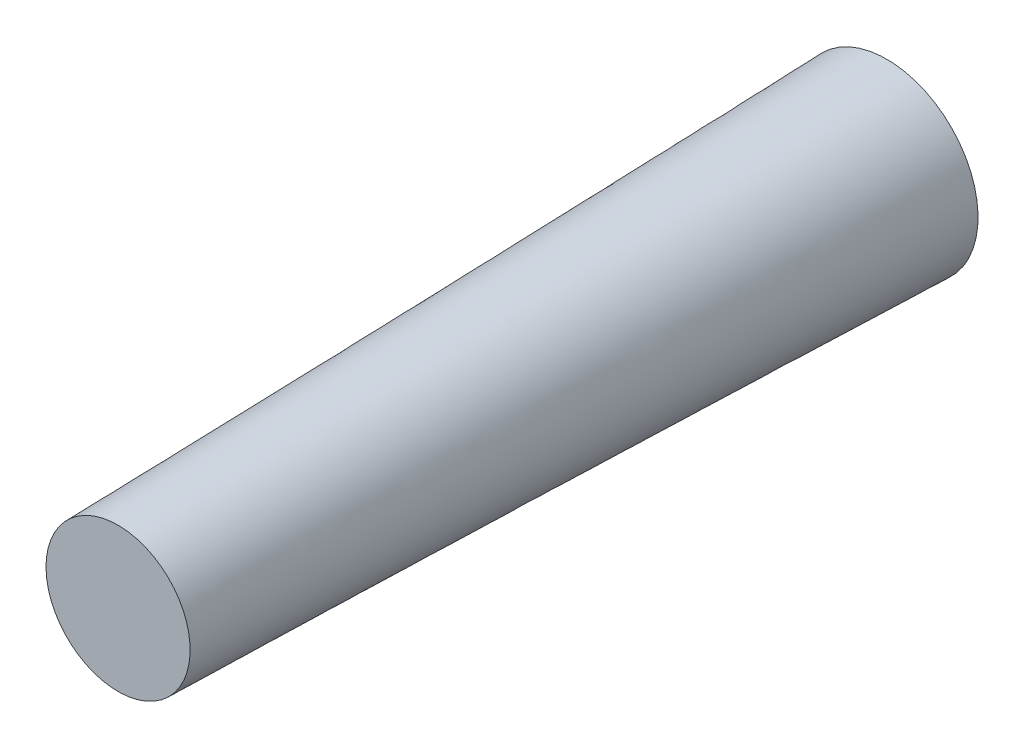
ISO-10303-21;
HEADER;
FILE_DESCRIPTION(('STEP AP214'),'2;1');
FILE_NAME('part.step','',(''),(''),'','','');
FILE_SCHEMA(('AUTOMOTIVE_DESIGN { 1 0 10303 214 1 1 1 1 }'));
ENDSEC;
DATA;
#1=APPLICATION_CONTEXT('core data for automotive mechanical design processes');
#2=APPLICATION_PROTOCOL_DEFINITION('international standard','automotive_design',2000,#1);
#3=PRODUCT_CONTEXT('',#1,'mechanical');
#4=PRODUCT('Part','Part','',(#3));
#5=PRODUCT_RELATED_PRODUCT_CATEGORY('part','',(#4));
#6=PRODUCT_DEFINITION_FORMATION('','',#4);
#7=PRODUCT_DEFINITION_CONTEXT('part definition',#1,'design');
#8=PRODUCT_DEFINITION('design','',#6,#7);
#9=PRODUCT_DEFINITION_SHAPE('','',#8);
#10=(LENGTH_UNIT() NAMED_UNIT(*) SI_UNIT(.MILLI.,.METRE.));
#11=(NAMED_UNIT(*) PLANE_ANGLE_UNIT() SI_UNIT($,.RADIAN.));
#12=(NAMED_UNIT(*) SI_UNIT($,.STERADIAN.) SOLID_ANGLE_UNIT());
#13=UNCERTAINTY_MEASURE_WITH_UNIT(LENGTH_MEASURE(1.E-05),#10,'distance_accuracy_value','');
#14=(GEOMETRIC_REPRESENTATION_CONTEXT(3) GLOBAL_UNCERTAINTY_ASSIGNED_CONTEXT((#13)) GLOBAL_UNIT_ASSIGNED_CONTEXT((#10,
#11,#12)) REPRESENTATION_CONTEXT('',''));
#15=CARTESIAN_POINT('',(0.,0.,0.));
#16=DIRECTION('',(0.,0.,1.));
#17=DIRECTION('',(1.,0.,0.));
#18=AXIS2_PLACEMENT_3D('',#15,#16,#17);
#19=CARTESIAN_POINT('',(0.,0.,0.));
#20=DIRECTION('',(0.,0.,1.));
#21=DIRECTION('',(1.,0.,0.));
#22=AXIS2_PLACEMENT_3D('',#19,#20,#21);
#23=PLANE('',#22);
#24=CARTESIAN_POINT('',(0.,0.,0.));
#25=DIRECTION('',(0.,0.,1.));
#26=DIRECTION('',(1.,0.,0.));
#27=AXIS2_PLACEMENT_3D('',#24,#25,#26);
#28=CIRCLE('',#27,12.065);
#29=CARTESIAN_POINT('',(-11.6089307231053,3.28587164480635,0.));
#30=VERTEX_POINT('',#29);
#31=EDGE_CURVE('E11',#30,#30,#28,.T.);
#32=ORIENTED_EDGE('',*,*,#31,.F.);
#33=EDGE_LOOP('',(#32));
#34=FACE_BOUND('',#33,.T.);
#35=ADVANCED_FACE('F35',(#34),#23,.F.);
#36=CARTESIAN_POINT('',(0.,0.,101.6));
#37=DIRECTION('',(0.,0.,1.));
#38=DIRECTION('',(1.,0.,0.));
#39=AXIS2_PLACEMENT_3D('',#36,#37,#38);
#40=PLANE('',#39);
#41=CARTESIAN_POINT('',(0.,0.,101.6));
#42=DIRECTION('',(0.,0.,1.));
#43=DIRECTION('',(1.,0.,0.));
#44=AXIS2_PLACEMENT_3D('',#41,#42,#43);
#45=CIRCLE('',#44,9.525);
#46=CARTESIAN_POINT('',(-9.5248796700365,-0.0478776704257421,101.6));
#47=VERTEX_POINT('',#46);
#48=EDGE_CURVE('E43',#47,#47,#45,.T.);
#49=ORIENTED_EDGE('',*,*,#48,.T.);
#50=EDGE_LOOP('',(#49));
#51=FACE_BOUND('',#50,.T.);
#52=ADVANCED_FACE('F67',(#51),#40,.T.);
#53=CARTESIAN_POINT('',(-9.5248796700365,-0.0478776704257421,101.6));
#54=CARTESIAN_POINT('',(-11.6089307231053,3.28587164480635,0.));
#55=CARTESIAN_POINT('',(-9.62063501088798,19.0018816696473,101.6));
#56=CARTESIAN_POINT('',(-5.03718743349257,26.5037330910169,0.));
#57=CARTESIAN_POINT('',(9.42912432918501,19.0976370104987,101.6));
#58=CARTESIAN_POINT('',(18.180674012718,19.9319898014042,0.));
#59=CARTESIAN_POINT('',(9.5248796700365,0.0478776704257433,101.6));
#60=CARTESIAN_POINT('',(11.6089307231053,-3.28587164480635,0.));
#61=CARTESIAN_POINT('',(9.62063501088799,-19.0018816696472,101.6));
#62=CARTESIAN_POINT('',(5.03718743349256,-26.5037330910169,0.));
#63=CARTESIAN_POINT('',(-9.42912432918501,-19.0976370104987,101.6));
#64=CARTESIAN_POINT('',(-18.180674012718,-19.9319898014042,0.));
#65=CARTESIAN_POINT('',(-9.5248796700365,-0.0478776704257421,101.6));
#66=CARTESIAN_POINT('',(-11.6089307231053,3.28587164480635,0.));
#67=(BOUNDED_SURFACE() B_SPLINE_SURFACE(3,1,((#53,#54),(#55,#56),(#57,#58),(#59,#60),(#61,#62),
(#63,#64),(#65,#66)),.UNSPECIFIED.,.T.,.F.,.F.) B_SPLINE_SURFACE_WITH_KNOTS((4,3,4),(2,2),(0.,
0.5,1.),(0.,1.),.UNSPECIFIED.) GEOMETRIC_REPRESENTATION_ITEM() RATIONAL_B_SPLINE_SURFACE(((1.,
1.),(0.333333333333333,0.333333333333333),(0.333333333333333,0.333333333333333),(1.,1.),
(0.333333333333334,0.333333333333333),(0.333333333333334,0.333333333333333),(1.,1.))) REPRESENTATION_ITEM('') SURFACE());
#68=CARTESIAN_POINT('',(-9.5248796700365,-0.0478776704257421,101.6));
#69=CARTESIAN_POINT('',(-9.54658853517263,-0.0131511150587413,100.541666666667));
#70=CARTESIAN_POINT('',(-9.56829740030877,0.0215754403082598,99.4833333333333));
#71=CARTESIAN_POINT('',(-9.61171513058103,0.0910285510422619,97.3666666666667));
#72=CARTESIAN_POINT('',(-9.63342399571717,0.125755106409263,96.3083333333333));
#73=CARTESIAN_POINT('',(-9.67684172598943,0.195208217143265,94.1916666666667));
#74=CARTESIAN_POINT('',(-9.69855059112557,0.229934772510266,93.1333333333333));
#75=CARTESIAN_POINT('',(-9.74196832139783,0.299387883244268,91.0166666666667));
#76=CARTESIAN_POINT('',(-9.76367718653396,0.334114438611269,89.9583333333333));
#77=CARTESIAN_POINT('',(-9.80709491680623,0.403567549345271,87.8416666666667));
#78=CARTESIAN_POINT('',(-9.82880378194236,0.438294104712272,86.7833333333333));
#79=CARTESIAN_POINT('',(-9.87222151221463,0.507747215446274,84.6666666666667));
#80=CARTESIAN_POINT('',(-9.89393037735076,0.542473770813275,83.6083333333333));
#81=CARTESIAN_POINT('',(-9.93734810762303,0.611926881547277,81.4916666666667));
#82=CARTESIAN_POINT('',(-9.95905697275916,0.646653436914278,80.4333333333333));
#83=CARTESIAN_POINT('',(-10.0024747030314,0.71610654764828,78.3166666666667));
#84=CARTESIAN_POINT('',(-10.0241835681676,0.750833103015281,77.2583333333333));
#85=CARTESIAN_POINT('',(-10.0676012984398,0.820286213749283,75.1416666666667));
#86=CARTESIAN_POINT('',(-10.089310163576,0.855012769116284,74.0833333333333));
#87=CARTESIAN_POINT('',(-10.1327278938482,0.924465879850286,71.9666666666667));
#88=CARTESIAN_POINT('',(-10.1544367589844,0.959192435217286,70.9083333333333));
#89=CARTESIAN_POINT('',(-10.1978544892566,1.02864554595129,68.7916666666667));
#90=CARTESIAN_POINT('',(-10.2195633543928,1.06337210131829,67.7333333333333));
#91=CARTESIAN_POINT('',(-10.262981084665,1.13282521205229,65.6166666666667));
#92=CARTESIAN_POINT('',(-10.2846899498012,1.16755176741929,64.5583333333333));
#93=CARTESIAN_POINT('',(-10.3281076800734,1.23700487815329,62.4416666666667));
#94=CARTESIAN_POINT('',(-10.3498165452096,1.2717314335203,61.3833333333333));
#95=CARTESIAN_POINT('',(-10.3932342754818,1.3411845442543,59.2666666666667));
#96=CARTESIAN_POINT('',(-10.414943140618,1.3759110996213,58.2083333333333));
#97=CARTESIAN_POINT('',(-10.4583608708902,1.4453642103553,56.0916666666667));
#98=CARTESIAN_POINT('',(-10.4800697360264,1.4800907657223,55.0333333333333));
#99=CARTESIAN_POINT('',(-10.5234874662986,1.5495438764563,52.9166666666667));
#100=CARTESIAN_POINT('',(-10.5451963314348,1.5842704318233,51.8583333333333));
#101=CARTESIAN_POINT('',(-10.588614061707,1.65372354255731,49.7416666666667));
#102=CARTESIAN_POINT('',(-10.6103229268432,1.68845009792431,48.6833333333333));
#103=CARTESIAN_POINT('',(-10.6537406571154,1.75790320865831,46.5666666666667));
#104=CARTESIAN_POINT('',(-10.6754495222516,1.79262976402531,45.5083333333333));
#105=CARTESIAN_POINT('',(-10.7188672525238,1.86208287475931,43.3916666666667));
#106=CARTESIAN_POINT('',(-10.74057611766,1.89680943012631,42.3333333333333));
#107=CARTESIAN_POINT('',(-10.7839938479322,1.96626254086032,40.2166666666667));
#108=CARTESIAN_POINT('',(-10.8057027130684,2.00098909622732,39.1583333333333));
#109=CARTESIAN_POINT('',(-10.8491204433406,2.07044220696132,37.0416666666667));
#110=CARTESIAN_POINT('',(-10.8708293084768,2.10516876232832,35.9833333333333));
#111=CARTESIAN_POINT('',(-10.914247038749,2.17462187306232,33.8666666666667));
#112=CARTESIAN_POINT('',(-10.9359559038851,2.20934842842932,32.8083333333333));
#113=CARTESIAN_POINT('',(-10.9793736341574,2.27880153916332,30.6916666666667));
#114=CARTESIAN_POINT('',(-11.0010824992935,2.31352809453033,29.6333333333333));
#115=CARTESIAN_POINT('',(-11.0445002295658,2.38298120526433,27.5166666666667));
#116=CARTESIAN_POINT('',(-11.0662090947019,2.41770776063133,26.4583333333333));
#117=CARTESIAN_POINT('',(-11.1096268249742,2.48716087136533,24.3416666666667));
#118=CARTESIAN_POINT('',(-11.1313356901103,2.52188742673233,23.2833333333333));
#119=CARTESIAN_POINT('',(-11.1747534203826,2.59134053746633,21.1666666666667));
#120=CARTESIAN_POINT('',(-11.1964622855187,2.62606709283333,20.1083333333333));
#121=CARTESIAN_POINT('',(-11.239880015791,2.69552020356734,17.9916666666667));
#122=CARTESIAN_POINT('',(-11.2615888809271,2.73024675893434,16.9333333333333));
#123=CARTESIAN_POINT('',(-11.3050066111994,2.79969986966834,14.8166666666667));
#124=CARTESIAN_POINT('',(-11.3267154763355,2.83442642503534,13.7583333333333));
#125=CARTESIAN_POINT('',(-11.3701332066078,2.90387953576934,11.6416666666667));
#126=CARTESIAN_POINT('',(-11.3918420717439,2.93860609113634,10.5833333333333));
#127=CARTESIAN_POINT('',(-11.4352598020162,3.00805920187034,8.46666666666667));
#128=CARTESIAN_POINT('',(-11.4569686671523,3.04278575723735,7.40833333333333));
#129=CARTESIAN_POINT('',(-11.5003863974246,3.11223886797135,5.29166666666667));
#130=CARTESIAN_POINT('',(-11.5220952625607,3.14696542333835,4.23333333333333));
#131=CARTESIAN_POINT('',(-11.565512992833,3.21641853407235,2.11666666666667));
#132=CARTESIAN_POINT('',(-11.5872218579691,3.25114508943935,1.05833333333333));
#133=CARTESIAN_POINT('',(-11.6089307231053,3.28587164480635,0.));
#134=B_SPLINE_CURVE_WITH_KNOTS('',3,(#68,#69,#70,#71,#72,#73,#74,#75,#76,#77,#78,#79,#80,#81,
#82,#83,#84,#85,#86,#87,#88,#89,#90,#91,#92,#93,#94,#95,#96,#97,#98,#99,#100,#101,#102,#103,
#104,#105,#106,#107,#108,#109,#110,#111,#112,#113,#114,#115,#116,#117,#118,#119,#120,#121,#122,
#123,#124,#125,#126,#127,#128,#129,#130,#131,#132,#133),.UNSPECIFIED.,.F.,.F.,(4,2,2,2,2,2,2,2,
2,2,2,2,2,2,2,2,2,2,2,2,2,2,2,2,2,2,2,2,2,2,2,2,4),(0.,3.17737625663981,6.35475251327961,
9.53212876991943,12.7095050265592,15.886881283199,19.0642575398389,22.2416337964787,
25.4190100531185,28.5963863097583,31.7737625663981,34.9511388230379,38.1285150796777,
41.3058913363175,44.4832675929573,47.6606438495972,50.838020106237,54.0153963628768,
57.1927726195166,60.3701488761564,63.5475251327962,66.724901389436,69.9022776460758,
73.0796539027156,76.2570301593555,79.4344064159953,82.6117826726351,85.7891589292749,
88.9665351859147,92.1439114425545,95.3212876991943,98.4986639558341,101.676040212474),.UNSPECIFIED.);
#135=EDGE_CURVE('BSEAM75',#47,#30,#134,.T.);
#136=ORIENTED_EDGE('',*,*,#48,.F.);
#137=ORIENTED_EDGE('',*,*,#31,.T.);
#138=ORIENTED_EDGE('',*,*,#135,.T.);
#139=ORIENTED_EDGE('',*,*,#135,.F.);
#140=EDGE_LOOP('',(#136,#138,#137,#139));
#141=FACE_BOUND('',#140,.T.);
#142=ADVANCED_FACE('F75',(#141),#67,.T.);
#143=CLOSED_SHELL('',(#35,#52,#142));
#144=MANIFOLD_SOLID_BREP('B2',#143);
#145=ADVANCED_BREP_SHAPE_REPRESENTATION('',(#18,#144),#14);
#146=SHAPE_DEFINITION_REPRESENTATION(#9,#145);
ENDSEC;
END-ISO-10303-21;
